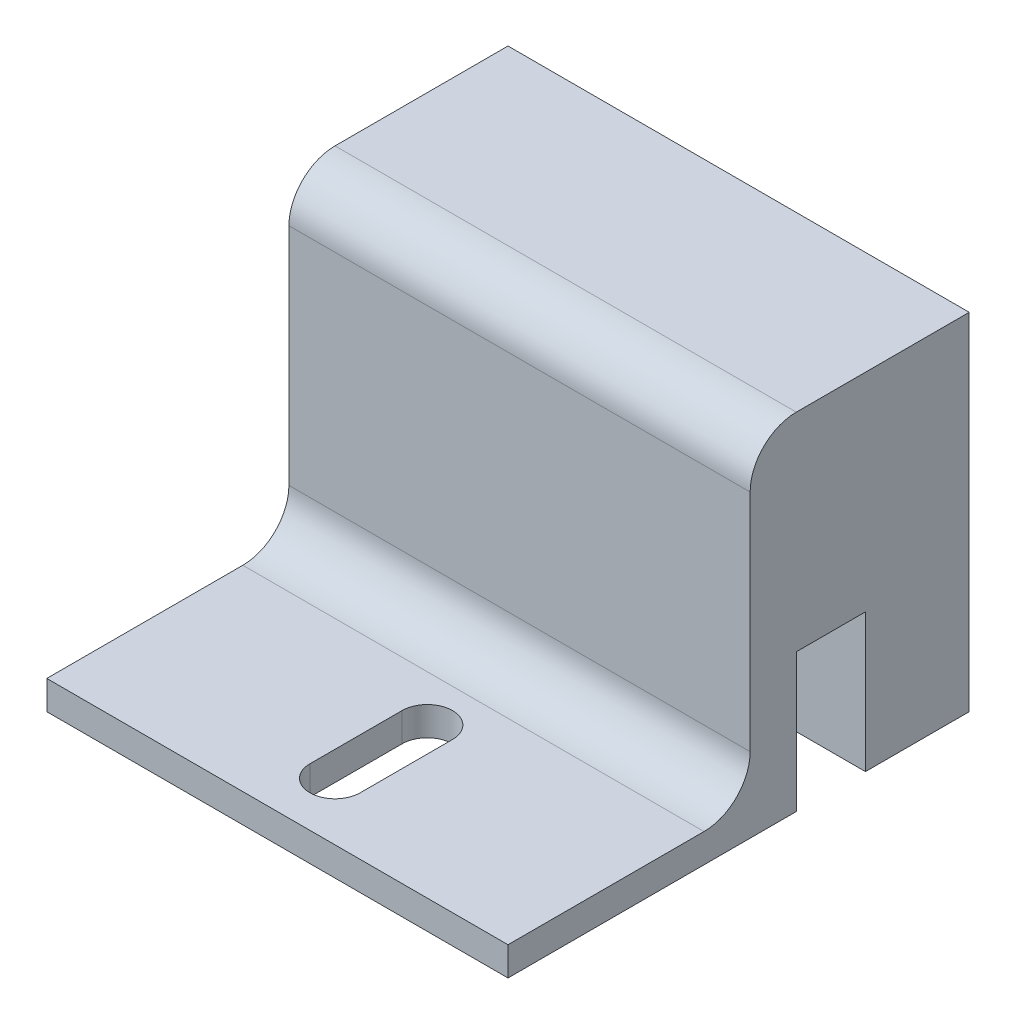
ISO-10303-21;
HEADER;
FILE_DESCRIPTION(('STEP AP214'),'2;1');
FILE_NAME('part.step','',(''),(''),'','','');
FILE_SCHEMA(('AUTOMOTIVE_DESIGN { 1 0 10303 214 1 1 1 1 }'));
ENDSEC;
DATA;
#1=APPLICATION_CONTEXT('core data for automotive mechanical design processes');
#2=APPLICATION_PROTOCOL_DEFINITION('international standard','automotive_design',2000,#1);
#3=PRODUCT_CONTEXT('',#1,'mechanical');
#4=PRODUCT('Part','Part','',(#3));
#5=PRODUCT_RELATED_PRODUCT_CATEGORY('part','',(#4));
#6=PRODUCT_DEFINITION_FORMATION('','',#4);
#7=PRODUCT_DEFINITION_CONTEXT('part definition',#1,'design');
#8=PRODUCT_DEFINITION('design','',#6,#7);
#9=PRODUCT_DEFINITION_SHAPE('','',#8);
#10=(LENGTH_UNIT() NAMED_UNIT(*) SI_UNIT(.MILLI.,.METRE.));
#11=(NAMED_UNIT(*) PLANE_ANGLE_UNIT() SI_UNIT($,.RADIAN.));
#12=(NAMED_UNIT(*) SI_UNIT($,.STERADIAN.) SOLID_ANGLE_UNIT());
#13=UNCERTAINTY_MEASURE_WITH_UNIT(LENGTH_MEASURE(1.E-05),#10,'distance_accuracy_value','');
#14=(GEOMETRIC_REPRESENTATION_CONTEXT(3) GLOBAL_UNCERTAINTY_ASSIGNED_CONTEXT((#13)) GLOBAL_UNIT_ASSIGNED_CONTEXT((#10,
#11,#12)) REPRESENTATION_CONTEXT('',''));
#15=CARTESIAN_POINT('',(0.,0.,0.));
#16=DIRECTION('',(0.,0.,1.));
#17=DIRECTION('',(1.,0.,0.));
#18=AXIS2_PLACEMENT_3D('',#15,#16,#17);
#19=CARTESIAN_POINT('',(50.8,38.1,0.));
#20=DIRECTION('',(0.,0.,1.));
#21=DIRECTION('',(1.,0.,0.));
#22=AXIS2_PLACEMENT_3D('',#19,#20,#21);
#23=PLANE('',#22);
#24=DIRECTION('',(0.,1.,0.));
#25=VECTOR('',#24,1.);
#26=CARTESIAN_POINT('',(0.,38.1,0.));
#27=LINE('',#26,#25);
#28=CARTESIAN_POINT('',(0.,0.,0.));
#29=VERTEX_POINT('',#28);
#30=CARTESIAN_POINT('',(0.,38.1,0.));
#31=VERTEX_POINT('',#30);
#32=EDGE_CURVE('E207',#29,#31,#27,.T.);
#33=ORIENTED_EDGE('',*,*,#32,.T.);
#34=DIRECTION('',(-1.,0.,0.));
#35=VECTOR('',#34,1.);
#36=CARTESIAN_POINT('',(50.8,38.1,0.));
#37=LINE('',#36,#35);
#38=CARTESIAN_POINT('',(50.8,38.1,0.));
#39=VERTEX_POINT('',#38);
#40=EDGE_CURVE('E303',#39,#31,#37,.T.);
#41=ORIENTED_EDGE('',*,*,#40,.F.);
#42=DIRECTION('',(0.,1.,0.));
#43=VECTOR('',#42,1.);
#44=CARTESIAN_POINT('',(50.8,38.1,0.));
#45=LINE('',#44,#43);
#46=CARTESIAN_POINT('',(50.8,0.,0.));
#47=VERTEX_POINT('',#46);
#48=EDGE_CURVE('E213',#47,#39,#45,.T.);
#49=ORIENTED_EDGE('',*,*,#48,.F.);
#50=DIRECTION('',(-1.,0.,0.));
#51=VECTOR('',#50,1.);
#52=CARTESIAN_POINT('',(50.8,0.,0.));
#53=LINE('',#52,#51);
#54=EDGE_CURVE('E245',#47,#29,#53,.T.);
#55=ORIENTED_EDGE('',*,*,#54,.T.);
#56=EDGE_LOOP('',(#33,#41,#49,#55));
#57=FACE_BOUND('',#56,.T.);
#58=ADVANCED_FACE('F43',(#57),#23,.F.);
#59=CARTESIAN_POINT('',(50.8,38.1,24.13));
#60=DIRECTION('',(0.,-1.,0.));
#61=DIRECTION('',(0.,0.,-1.));
#62=AXIS2_PLACEMENT_3D('',#59,#60,#61);
#63=PLANE('',#62);
#64=DIRECTION('',(0.,0.,1.));
#65=VECTOR('',#64,1.);
#66=CARTESIAN_POINT('',(0.,38.1,24.13));
#67=LINE('',#66,#65);
#68=CARTESIAN_POINT('',(0.,38.1,19.05));
#69=VERTEX_POINT('',#68);
#70=EDGE_CURVE('E249',#31,#69,#67,.T.);
#71=ORIENTED_EDGE('',*,*,#70,.T.);
#72=DIRECTION('',(-1.,0.,0.));
#73=VECTOR('',#72,1.);
#74=CARTESIAN_POINT('',(50.8,38.1,19.05));
#75=LINE('',#74,#73);
#76=CARTESIAN_POINT('',(50.8,38.1,19.05));
#77=VERTEX_POINT('',#76);
#78=EDGE_CURVE('E65',#69,#77,#75,.F.);
#79=ORIENTED_EDGE('',*,*,#78,.T.);
#80=DIRECTION('',(0.,0.,1.));
#81=VECTOR('',#80,1.);
#82=CARTESIAN_POINT('',(50.8,38.1,24.13));
#83=LINE('',#82,#81);
#84=EDGE_CURVE('E217',#39,#77,#83,.T.);
#85=ORIENTED_EDGE('',*,*,#84,.F.);
#86=ORIENTED_EDGE('',*,*,#40,.T.);
#87=EDGE_LOOP('',(#71,#79,#85,#86));
#88=FACE_BOUND('',#87,.T.);
#89=ADVANCED_FACE('F374',(#88),#63,.F.);
#90=CARTESIAN_POINT('',(50.8,3.175,24.13));
#91=DIRECTION('',(0.,0.,-1.));
#92=DIRECTION('',(-1.,0.,0.));
#93=AXIS2_PLACEMENT_3D('',#90,#91,#92);
#94=PLANE('',#93);
#95=DIRECTION('',(0.,-1.,0.));
#96=VECTOR('',#95,1.);
#97=CARTESIAN_POINT('',(50.8,3.175,24.13));
#98=LINE('',#97,#96);
#99=CARTESIAN_POINT('',(50.8,33.02,24.13));
#100=VERTEX_POINT('',#99);
#101=CARTESIAN_POINT('',(50.8,8.255,24.13));
#102=VERTEX_POINT('',#101);
#103=EDGE_CURVE('E221',#100,#102,#98,.T.);
#104=ORIENTED_EDGE('',*,*,#103,.F.);
#105=DIRECTION('',(-1.,0.,0.));
#106=VECTOR('',#105,1.);
#107=CARTESIAN_POINT('',(50.8,33.02,24.13));
#108=LINE('',#107,#106);
#109=CARTESIAN_POINT('',(0.,33.02,24.13));
#110=VERTEX_POINT('',#109);
#111=EDGE_CURVE('E310',#100,#110,#108,.T.);
#112=ORIENTED_EDGE('',*,*,#111,.T.);
#113=DIRECTION('',(0.,-1.,0.));
#114=VECTOR('',#113,1.);
#115=CARTESIAN_POINT('',(0.,3.175,24.13));
#116=LINE('',#115,#114);
#117=CARTESIAN_POINT('',(0.,8.255,24.13));
#118=VERTEX_POINT('',#117);
#119=EDGE_CURVE('E252',#110,#118,#116,.T.);
#120=ORIENTED_EDGE('',*,*,#119,.T.);
#121=DIRECTION('',(-1.,0.,0.));
#122=VECTOR('',#121,1.);
#123=CARTESIAN_POINT('',(50.8,8.255,24.13));
#124=LINE('',#123,#122);
#125=EDGE_CURVE('E307',#118,#102,#124,.F.);
#126=ORIENTED_EDGE('',*,*,#125,.T.);
#127=EDGE_LOOP('',(#104,#112,#120,#126));
#128=FACE_BOUND('',#127,.T.);
#129=ADVANCED_FACE('F336',(#128),#94,.F.);
#130=CARTESIAN_POINT('',(50.8,3.175,50.8));
#131=DIRECTION('',(0.,-1.,0.));
#132=DIRECTION('',(0.,0.,-1.));
#133=AXIS2_PLACEMENT_3D('',#130,#131,#132);
#134=PLANE('',#133);
#135=DIRECTION('',(0.,0.,1.));
#136=VECTOR('',#135,1.);
#137=CARTESIAN_POINT('',(22.6314,3.17499999999999,34.29));
#138=LINE('',#137,#136);
#139=CARTESIAN_POINT('',(22.6314,3.175,34.29));
#140=VERTEX_POINT('',#139);
#141=CARTESIAN_POINT('',(22.6314,3.17499999999999,44.45));
#142=VERTEX_POINT('',#141);
#143=EDGE_CURVE('E198',#140,#142,#138,.T.);
#144=ORIENTED_EDGE('',*,*,#143,.F.);
#145=CARTESIAN_POINT('',(25.4,3.17499999999999,34.29));
#146=DIRECTION('',(0.,1.,0.));
#147=DIRECTION('',(0.,0.,1.));
#148=AXIS2_PLACEMENT_3D('',#145,#146,#147);
#149=CIRCLE('',#148,2.7686);
#150=CARTESIAN_POINT('',(28.1686,3.17499999999999,34.29));
#151=VERTEX_POINT('',#150);
#152=EDGE_CURVE('E164',#151,#140,#149,.T.);
#153=ORIENTED_EDGE('',*,*,#152,.F.);
#154=DIRECTION('',(0.,0.,-1.));
#155=VECTOR('',#154,1.);
#156=CARTESIAN_POINT('',(28.1686,3.17499999999999,34.29));
#157=LINE('',#156,#155);
#158=CARTESIAN_POINT('',(28.1686,3.17499999999999,44.45));
#159=VERTEX_POINT('',#158);
#160=EDGE_CURVE('E185',#159,#151,#157,.T.);
#161=ORIENTED_EDGE('',*,*,#160,.F.);
#162=CARTESIAN_POINT('',(25.4,3.17499999999999,44.45));
#163=DIRECTION('',(0.,1.,0.));
#164=DIRECTION('',(0.,0.,1.));
#165=AXIS2_PLACEMENT_3D('',#162,#163,#164);
#166=CIRCLE('',#165,2.76859999999999);
#167=EDGE_CURVE('E189',#142,#159,#166,.T.);
#168=ORIENTED_EDGE('',*,*,#167,.F.);
#169=EDGE_LOOP('',(#144,#153,#161,#168));
#170=FACE_BOUND('',#169,.T.);
#171=DIRECTION('',(0.,0.,1.));
#172=VECTOR('',#171,1.);
#173=CARTESIAN_POINT('',(50.8,3.175,50.8));
#174=LINE('',#173,#172);
#175=CARTESIAN_POINT('',(50.8,3.175,29.21));
#176=VERTEX_POINT('',#175);
#177=CARTESIAN_POINT('',(50.8,3.175,50.8));
#178=VERTEX_POINT('',#177);
#179=EDGE_CURVE('E224',#176,#178,#174,.T.);
#180=ORIENTED_EDGE('',*,*,#179,.F.);
#181=DIRECTION('',(-1.,0.,0.));
#182=VECTOR('',#181,1.);
#183=CARTESIAN_POINT('',(0.,3.175,29.21));
#184=LINE('',#183,#182);
#185=CARTESIAN_POINT('',(0.,3.175,29.21));
#186=VERTEX_POINT('',#185);
#187=EDGE_CURVE('E322',#176,#186,#184,.T.);
#188=ORIENTED_EDGE('',*,*,#187,.T.);
#189=DIRECTION('',(0.,0.,1.));
#190=VECTOR('',#189,1.);
#191=CARTESIAN_POINT('',(0.,3.175,50.8));
#192=LINE('',#191,#190);
#193=CARTESIAN_POINT('',(0.,3.175,50.8));
#194=VERTEX_POINT('',#193);
#195=EDGE_CURVE('E256',#186,#194,#192,.T.);
#196=ORIENTED_EDGE('',*,*,#195,.T.);
#197=DIRECTION('',(-1.,0.,0.));
#198=VECTOR('',#197,1.);
#199=CARTESIAN_POINT('',(50.8,3.175,50.8));
#200=LINE('',#199,#198);
#201=EDGE_CURVE('E299',#178,#194,#200,.T.);
#202=ORIENTED_EDGE('',*,*,#201,.F.);
#203=EDGE_LOOP('',(#180,#188,#196,#202));
#204=FACE_BOUND('',#203,.T.);
#205=ADVANCED_FACE('F339',(#170,#204),#134,.F.);
#206=CARTESIAN_POINT('',(50.8,0.,50.8));
#207=DIRECTION('',(0.,0.,-1.));
#208=DIRECTION('',(0.,1.,0.));
#209=AXIS2_PLACEMENT_3D('',#206,#207,#208);
#210=PLANE('',#209);
#211=DIRECTION('',(0.,-1.,0.));
#212=VECTOR('',#211,1.);
#213=CARTESIAN_POINT('',(0.,0.,50.8));
#214=LINE('',#213,#212);
#215=CARTESIAN_POINT('',(0.,0.,50.8));
#216=VERTEX_POINT('',#215);
#217=EDGE_CURVE('E259',#194,#216,#214,.T.);
#218=ORIENTED_EDGE('',*,*,#217,.T.);
#219=DIRECTION('',(-1.,0.,0.));
#220=VECTOR('',#219,1.);
#221=CARTESIAN_POINT('',(50.8,0.,50.8));
#222=LINE('',#221,#220);
#223=CARTESIAN_POINT('',(50.8,0.,50.8));
#224=VERTEX_POINT('',#223);
#225=EDGE_CURVE('E295',#224,#216,#222,.T.);
#226=ORIENTED_EDGE('',*,*,#225,.F.);
#227=DIRECTION('',(0.,-1.,0.));
#228=VECTOR('',#227,1.);
#229=CARTESIAN_POINT('',(50.8,0.,50.8));
#230=LINE('',#229,#228);
#231=EDGE_CURVE('E227',#178,#224,#230,.T.);
#232=ORIENTED_EDGE('',*,*,#231,.F.);
#233=ORIENTED_EDGE('',*,*,#201,.T.);
#234=EDGE_LOOP('',(#218,#226,#232,#233));
#235=FACE_BOUND('',#234,.T.);
#236=ADVANCED_FACE('F347',(#235),#210,.F.);
#237=CARTESIAN_POINT('',(50.8,0.,19.05));
#238=DIRECTION('',(0.,1.,0.));
#239=DIRECTION('',(0.,0.,1.));
#240=AXIS2_PLACEMENT_3D('',#237,#238,#239);
#241=PLANE('',#240);
#242=DIRECTION('',(0.,0.,-1.));
#243=VECTOR('',#242,1.);
#244=CARTESIAN_POINT('',(28.1686,0.,34.29));
#245=LINE('',#244,#243);
#246=CARTESIAN_POINT('',(28.1686,0.,44.45));
#247=VERTEX_POINT('',#246);
#248=CARTESIAN_POINT('',(28.1686,0.,34.29));
#249=VERTEX_POINT('',#248);
#250=EDGE_CURVE('E170',#247,#249,#245,.T.);
#251=ORIENTED_EDGE('',*,*,#250,.T.);
#252=CARTESIAN_POINT('',(25.4,0.,34.29));
#253=DIRECTION('',(0.,1.,0.));
#254=DIRECTION('',(0.,0.,1.));
#255=AXIS2_PLACEMENT_3D('',#252,#253,#254);
#256=CIRCLE('',#255,2.7686);
#257=CARTESIAN_POINT('',(22.6314,0.,34.29));
#258=VERTEX_POINT('',#257);
#259=EDGE_CURVE('E161',#249,#258,#256,.T.);
#260=ORIENTED_EDGE('',*,*,#259,.T.);
#261=DIRECTION('',(0.,0.,1.));
#262=VECTOR('',#261,1.);
#263=CARTESIAN_POINT('',(22.6314,0.,34.29));
#264=LINE('',#263,#262);
#265=CARTESIAN_POINT('',(22.6314,0.,44.45));
#266=VERTEX_POINT('',#265);
#267=EDGE_CURVE('E174',#258,#266,#264,.T.);
#268=ORIENTED_EDGE('',*,*,#267,.T.);
#269=CARTESIAN_POINT('',(25.4,0.,44.45));
#270=DIRECTION('',(0.,1.,0.));
#271=DIRECTION('',(0.,0.,1.));
#272=AXIS2_PLACEMENT_3D('',#269,#270,#271);
#273=CIRCLE('',#272,2.76859999999999);
#274=EDGE_CURVE('E179',#266,#247,#273,.T.);
#275=ORIENTED_EDGE('',*,*,#274,.T.);
#276=EDGE_LOOP('',(#251,#260,#268,#275));
#277=FACE_BOUND('',#276,.T.);
#278=DIRECTION('',(0.,0.,-1.));
#279=VECTOR('',#278,1.);
#280=CARTESIAN_POINT('',(0.,0.,19.05));
#281=LINE('',#280,#279);
#282=CARTESIAN_POINT('',(0.,0.,19.05));
#283=VERTEX_POINT('',#282);
#284=EDGE_CURVE('E262',#216,#283,#281,.T.);
#285=ORIENTED_EDGE('',*,*,#284,.T.);
#286=DIRECTION('',(-1.,0.,0.));
#287=VECTOR('',#286,1.);
#288=CARTESIAN_POINT('',(50.8,0.,19.05));
#289=LINE('',#288,#287);
#290=CARTESIAN_POINT('',(50.8,0.,19.05));
#291=VERTEX_POINT('',#290);
#292=EDGE_CURVE('E291',#291,#283,#289,.T.);
#293=ORIENTED_EDGE('',*,*,#292,.F.);
#294=DIRECTION('',(0.,0.,-1.));
#295=VECTOR('',#294,1.);
#296=CARTESIAN_POINT('',(50.8,0.,19.05));
#297=LINE('',#296,#295);
#298=EDGE_CURVE('E230',#224,#291,#297,.T.);
#299=ORIENTED_EDGE('',*,*,#298,.F.);
#300=ORIENTED_EDGE('',*,*,#225,.T.);
#301=EDGE_LOOP('',(#285,#293,#299,#300));
#302=FACE_BOUND('',#301,.T.);
#303=ADVANCED_FACE('F181',(#277,#302),#241,.F.);
#304=CARTESIAN_POINT('',(50.8,15.24,19.05));
#305=DIRECTION('',(0.,0.,1.));
#306=DIRECTION('',(0.,-1.,0.));
#307=AXIS2_PLACEMENT_3D('',#304,#305,#306);
#308=PLANE('',#307);
#309=DIRECTION('',(0.,1.,0.));
#310=VECTOR('',#309,1.);
#311=CARTESIAN_POINT('',(0.,15.24,19.05));
#312=LINE('',#311,#310);
#313=CARTESIAN_POINT('',(0.,15.24,19.05));
#314=VERTEX_POINT('',#313);
#315=EDGE_CURVE('E265',#283,#314,#312,.T.);
#316=ORIENTED_EDGE('',*,*,#315,.T.);
#317=DIRECTION('',(-1.,0.,0.));
#318=VECTOR('',#317,1.);
#319=CARTESIAN_POINT('',(50.8,15.24,19.05));
#320=LINE('',#319,#318);
#321=CARTESIAN_POINT('',(50.8,15.24,19.05));
#322=VERTEX_POINT('',#321);
#323=EDGE_CURVE('E287',#322,#314,#320,.T.);
#324=ORIENTED_EDGE('',*,*,#323,.F.);
#325=DIRECTION('',(0.,1.,0.));
#326=VECTOR('',#325,1.);
#327=CARTESIAN_POINT('',(50.8,15.24,19.05));
#328=LINE('',#327,#326);
#329=EDGE_CURVE('E233',#291,#322,#328,.T.);
#330=ORIENTED_EDGE('',*,*,#329,.F.);
#331=ORIENTED_EDGE('',*,*,#292,.T.);
#332=EDGE_LOOP('',(#316,#324,#330,#331));
#333=FACE_BOUND('',#332,.T.);
#334=ADVANCED_FACE('F353',(#333),#308,.F.);
#335=CARTESIAN_POINT('',(50.8,15.24,11.43));
#336=DIRECTION('',(0.,1.,0.));
#337=DIRECTION('',(0.,0.,1.));
#338=AXIS2_PLACEMENT_3D('',#335,#336,#337);
#339=PLANE('',#338);
#340=DIRECTION('',(0.,0.,-1.));
#341=VECTOR('',#340,1.);
#342=CARTESIAN_POINT('',(0.,15.24,11.43));
#343=LINE('',#342,#341);
#344=CARTESIAN_POINT('',(0.,15.24,11.43));
#345=VERTEX_POINT('',#344);
#346=EDGE_CURVE('E268',#314,#345,#343,.T.);
#347=ORIENTED_EDGE('',*,*,#346,.T.);
#348=DIRECTION('',(-1.,0.,0.));
#349=VECTOR('',#348,1.);
#350=CARTESIAN_POINT('',(50.8,15.24,11.43));
#351=LINE('',#350,#349);
#352=CARTESIAN_POINT('',(50.8,15.24,11.43));
#353=VERTEX_POINT('',#352);
#354=EDGE_CURVE('E283',#353,#345,#351,.T.);
#355=ORIENTED_EDGE('',*,*,#354,.F.);
#356=DIRECTION('',(0.,0.,-1.));
#357=VECTOR('',#356,1.);
#358=CARTESIAN_POINT('',(50.8,15.24,11.43));
#359=LINE('',#358,#357);
#360=EDGE_CURVE('E236',#322,#353,#359,.T.);
#361=ORIENTED_EDGE('',*,*,#360,.F.);
#362=ORIENTED_EDGE('',*,*,#323,.T.);
#363=EDGE_LOOP('',(#347,#355,#361,#362));
#364=FACE_BOUND('',#363,.T.);
#365=ADVANCED_FACE('F359',(#364),#339,.F.);
#366=CARTESIAN_POINT('',(50.8,0.,11.43));
#367=DIRECTION('',(0.,0.,-1.));
#368=DIRECTION('',(0.,1.,0.));
#369=AXIS2_PLACEMENT_3D('',#366,#367,#368);
#370=PLANE('',#369);
#371=DIRECTION('',(0.,-1.,0.));
#372=VECTOR('',#371,1.);
#373=CARTESIAN_POINT('',(0.,0.,11.43));
#374=LINE('',#373,#372);
#375=CARTESIAN_POINT('',(0.,0.,11.43));
#376=VERTEX_POINT('',#375);
#377=EDGE_CURVE('E271',#345,#376,#374,.T.);
#378=ORIENTED_EDGE('',*,*,#377,.T.);
#379=DIRECTION('',(-1.,0.,0.));
#380=VECTOR('',#379,1.);
#381=CARTESIAN_POINT('',(50.8,0.,11.43));
#382=LINE('',#381,#380);
#383=CARTESIAN_POINT('',(50.8,0.,11.43));
#384=VERTEX_POINT('',#383);
#385=EDGE_CURVE('E279',#384,#376,#382,.T.);
#386=ORIENTED_EDGE('',*,*,#385,.F.);
#387=DIRECTION('',(0.,-1.,0.));
#388=VECTOR('',#387,1.);
#389=CARTESIAN_POINT('',(50.8,0.,11.43));
#390=LINE('',#389,#388);
#391=EDGE_CURVE('E239',#353,#384,#390,.T.);
#392=ORIENTED_EDGE('',*,*,#391,.F.);
#393=ORIENTED_EDGE('',*,*,#354,.T.);
#394=EDGE_LOOP('',(#378,#386,#392,#393));
#395=FACE_BOUND('',#394,.T.);
#396=ADVANCED_FACE('F363',(#395),#370,.F.);
#397=CARTESIAN_POINT('',(50.8,0.,0.));
#398=DIRECTION('',(0.,1.,0.));
#399=DIRECTION('',(0.,0.,1.));
#400=AXIS2_PLACEMENT_3D('',#397,#398,#399);
#401=PLANE('',#400);
#402=DIRECTION('',(0.,0.,-1.));
#403=VECTOR('',#402,1.);
#404=CARTESIAN_POINT('',(0.,0.,0.));
#405=LINE('',#404,#403);
#406=EDGE_CURVE('E218',#376,#29,#405,.T.);
#407=ORIENTED_EDGE('',*,*,#406,.T.);
#408=ORIENTED_EDGE('',*,*,#54,.F.);
#409=DIRECTION('',(0.,0.,-1.));
#410=VECTOR('',#409,1.);
#411=CARTESIAN_POINT('',(50.8,0.,0.));
#412=LINE('',#411,#410);
#413=EDGE_CURVE('E242',#384,#47,#412,.T.);
#414=ORIENTED_EDGE('',*,*,#413,.F.);
#415=ORIENTED_EDGE('',*,*,#385,.T.);
#416=EDGE_LOOP('',(#407,#408,#414,#415));
#417=FACE_BOUND('',#416,.T.);
#418=ADVANCED_FACE('F368',(#417),#401,.F.);
#419=CARTESIAN_POINT('',(50.8,0.,0.));
#420=DIRECTION('',(-1.,0.,0.));
#421=DIRECTION('',(0.,0.,1.));
#422=AXIS2_PLACEMENT_3D('',#419,#420,#421);
#423=PLANE('',#422);
#424=ORIENTED_EDGE('',*,*,#84,.T.);
#425=CARTESIAN_POINT('',(50.8,33.02,19.05));
#426=DIRECTION('',(-1.,0.,0.));
#427=DIRECTION('',(0.,0.,1.));
#428=AXIS2_PLACEMENT_3D('',#425,#426,#427);
#429=CIRCLE('',#428,5.08);
#430=EDGE_CURVE('E319',#77,#100,#429,.F.);
#431=ORIENTED_EDGE('',*,*,#430,.T.);
#432=ORIENTED_EDGE('',*,*,#103,.T.);
#433=CARTESIAN_POINT('',(50.8,8.255,29.21));
#434=DIRECTION('',(-1.,0.,0.));
#435=DIRECTION('',(0.,0.,1.));
#436=AXIS2_PLACEMENT_3D('',#433,#434,#435);
#437=CIRCLE('',#436,5.08);
#438=EDGE_CURVE('E11',#102,#176,#437,.T.);
#439=ORIENTED_EDGE('',*,*,#438,.T.);
#440=ORIENTED_EDGE('',*,*,#179,.T.);
#441=ORIENTED_EDGE('',*,*,#231,.T.);
#442=ORIENTED_EDGE('',*,*,#298,.T.);
#443=ORIENTED_EDGE('',*,*,#329,.T.);
#444=ORIENTED_EDGE('',*,*,#360,.T.);
#445=ORIENTED_EDGE('',*,*,#391,.T.);
#446=ORIENTED_EDGE('',*,*,#413,.T.);
#447=ORIENTED_EDGE('',*,*,#48,.T.);
#448=EDGE_LOOP('',(#424,#431,#432,#439,#440,#441,#442,#443,#444,#445,#446,#447));
#449=FACE_BOUND('',#448,.T.);
#450=ADVANCED_FACE('F342',(#449),#423,.F.);
#451=CARTESIAN_POINT('',(0.,0.,0.));
#452=DIRECTION('',(-1.,0.,0.));
#453=DIRECTION('',(0.,0.,1.));
#454=AXIS2_PLACEMENT_3D('',#451,#452,#453);
#455=PLANE('',#454);
#456=ORIENTED_EDGE('',*,*,#119,.F.);
#457=CARTESIAN_POINT('',(0.,33.02,19.05));
#458=DIRECTION('',(-1.,0.,0.));
#459=DIRECTION('',(0.,0.,1.));
#460=AXIS2_PLACEMENT_3D('',#457,#458,#459);
#461=CIRCLE('',#460,5.08);
#462=EDGE_CURVE('E314',#110,#69,#461,.T.);
#463=ORIENTED_EDGE('',*,*,#462,.T.);
#464=ORIENTED_EDGE('',*,*,#70,.F.);
#465=ORIENTED_EDGE('',*,*,#32,.F.);
#466=ORIENTED_EDGE('',*,*,#406,.F.);
#467=ORIENTED_EDGE('',*,*,#377,.F.);
#468=ORIENTED_EDGE('',*,*,#346,.F.);
#469=ORIENTED_EDGE('',*,*,#315,.F.);
#470=ORIENTED_EDGE('',*,*,#284,.F.);
#471=ORIENTED_EDGE('',*,*,#217,.F.);
#472=ORIENTED_EDGE('',*,*,#195,.F.);
#473=CARTESIAN_POINT('',(0.,8.255,29.21));
#474=DIRECTION('',(-1.,0.,0.));
#475=DIRECTION('',(0.,0.,1.));
#476=AXIS2_PLACEMENT_3D('',#473,#474,#475);
#477=CIRCLE('',#476,5.08);
#478=EDGE_CURVE('E52',#186,#118,#477,.F.);
#479=ORIENTED_EDGE('',*,*,#478,.T.);
#480=EDGE_LOOP('',(#456,#463,#464,#465,#466,#467,#468,#469,#470,#471,#472,#479));
#481=FACE_BOUND('',#480,.T.);
#482=ADVANCED_FACE('F329',(#481),#455,.T.);
#483=CARTESIAN_POINT('',(25.4,0.,34.29));
#484=DIRECTION('',(0.,1.,0.));
#485=DIRECTION('',(0.,0.,1.));
#486=AXIS2_PLACEMENT_3D('',#483,#484,#485);
#487=CYLINDRICAL_SURFACE('',#486,2.7686);
#488=ORIENTED_EDGE('',*,*,#152,.T.);
#489=DIRECTION('',(0.,1.,0.));
#490=VECTOR('',#489,1.);
#491=CARTESIAN_POINT('',(22.6314,0.,34.29));
#492=LINE('',#491,#490);
#493=EDGE_CURVE('E157',#258,#140,#492,.T.);
#494=ORIENTED_EDGE('',*,*,#493,.F.);
#495=ORIENTED_EDGE('',*,*,#259,.F.);
#496=DIRECTION('',(0.,1.,0.));
#497=VECTOR('',#496,1.);
#498=CARTESIAN_POINT('',(28.1686,0.,34.29));
#499=LINE('',#498,#497);
#500=EDGE_CURVE('E204',#249,#151,#499,.T.);
#501=ORIENTED_EDGE('',*,*,#500,.T.);
#502=EDGE_LOOP('',(#488,#494,#495,#501));
#503=FACE_BOUND('',#502,.T.);
#504=ADVANCED_FACE('F159',(#503),#487,.F.);
#505=CARTESIAN_POINT('',(28.1686,0.,34.29));
#506=DIRECTION('',(1.,0.,0.));
#507=DIRECTION('',(0.,0.,-1.));
#508=AXIS2_PLACEMENT_3D('',#505,#506,#507);
#509=PLANE('',#508);
#510=ORIENTED_EDGE('',*,*,#160,.T.);
#511=ORIENTED_EDGE('',*,*,#500,.F.);
#512=ORIENTED_EDGE('',*,*,#250,.F.);
#513=DIRECTION('',(0.,1.,0.));
#514=VECTOR('',#513,1.);
#515=CARTESIAN_POINT('',(28.1686,0.,44.45));
#516=LINE('',#515,#514);
#517=EDGE_CURVE('E208',#247,#159,#516,.T.);
#518=ORIENTED_EDGE('',*,*,#517,.T.);
#519=EDGE_LOOP('',(#510,#511,#512,#518));
#520=FACE_BOUND('',#519,.T.);
#521=ADVANCED_FACE('F413',(#520),#509,.F.);
#522=CARTESIAN_POINT('',(25.4,0.,44.45));
#523=DIRECTION('',(0.,1.,0.));
#524=DIRECTION('',(0.,0.,1.));
#525=AXIS2_PLACEMENT_3D('',#522,#523,#524);
#526=CYLINDRICAL_SURFACE('',#525,2.76859999999999);
#527=ORIENTED_EDGE('',*,*,#167,.T.);
#528=ORIENTED_EDGE('',*,*,#517,.F.);
#529=ORIENTED_EDGE('',*,*,#274,.F.);
#530=DIRECTION('',(0.,1.,0.));
#531=VECTOR('',#530,1.);
#532=CARTESIAN_POINT('',(22.6314,0.,44.45));
#533=LINE('',#532,#531);
#534=EDGE_CURVE('E169',#266,#142,#533,.T.);
#535=ORIENTED_EDGE('',*,*,#534,.T.);
#536=EDGE_LOOP('',(#527,#528,#529,#535));
#537=FACE_BOUND('',#536,.T.);
#538=ADVANCED_FACE('F382',(#537),#526,.F.);
#539=CARTESIAN_POINT('',(22.6314,0.,34.29));
#540=DIRECTION('',(-1.,0.,0.));
#541=DIRECTION('',(0.,0.,1.));
#542=AXIS2_PLACEMENT_3D('',#539,#540,#541);
#543=PLANE('',#542);
#544=ORIENTED_EDGE('',*,*,#143,.T.);
#545=ORIENTED_EDGE('',*,*,#534,.F.);
#546=ORIENTED_EDGE('',*,*,#267,.F.);
#547=ORIENTED_EDGE('',*,*,#493,.T.);
#548=EDGE_LOOP('',(#544,#545,#546,#547));
#549=FACE_BOUND('',#548,.T.);
#550=ADVANCED_FACE('F175',(#549),#543,.F.);
#551=CARTESIAN_POINT('',(50.8,33.02,19.05));
#552=DIRECTION('',(-1.,0.,0.));
#553=DIRECTION('',(0.,0.,1.));
#554=AXIS2_PLACEMENT_3D('',#551,#552,#553);
#555=CYLINDRICAL_SURFACE('',#554,5.08);
#556=ORIENTED_EDGE('',*,*,#430,.F.);
#557=ORIENTED_EDGE('',*,*,#78,.F.);
#558=ORIENTED_EDGE('',*,*,#462,.F.);
#559=ORIENTED_EDGE('',*,*,#111,.F.);
#560=EDGE_LOOP('',(#556,#557,#558,#559));
#561=FACE_BOUND('',#560,.T.);
#562=ADVANCED_FACE('F376',(#561),#555,.T.);
#563=CARTESIAN_POINT('',(50.8,8.255,29.21));
#564=DIRECTION('',(1.,0.,0.));
#565=DIRECTION('',(0.,0.,-1.));
#566=AXIS2_PLACEMENT_3D('',#563,#564,#565);
#567=CYLINDRICAL_SURFACE('',#566,5.08);
#568=ORIENTED_EDGE('',*,*,#438,.F.);
#569=ORIENTED_EDGE('',*,*,#125,.F.);
#570=ORIENTED_EDGE('',*,*,#478,.F.);
#571=ORIENTED_EDGE('',*,*,#187,.F.);
#572=EDGE_LOOP('',(#568,#569,#570,#571));
#573=FACE_BOUND('',#572,.T.);
#574=ADVANCED_FACE('F45',(#573),#567,.F.);
#575=CLOSED_SHELL('',(#58,#89,#129,#205,#236,#303,#334,#365,#396,#418,#450,#482,#504,#521,#538,
#550,#562,#574));
#576=MANIFOLD_SOLID_BREP('B2',#575);
#577=ADVANCED_BREP_SHAPE_REPRESENTATION('',(#18,#576),#14);
#578=SHAPE_DEFINITION_REPRESENTATION(#9,#577);
ENDSEC;
END-ISO-10303-21;
